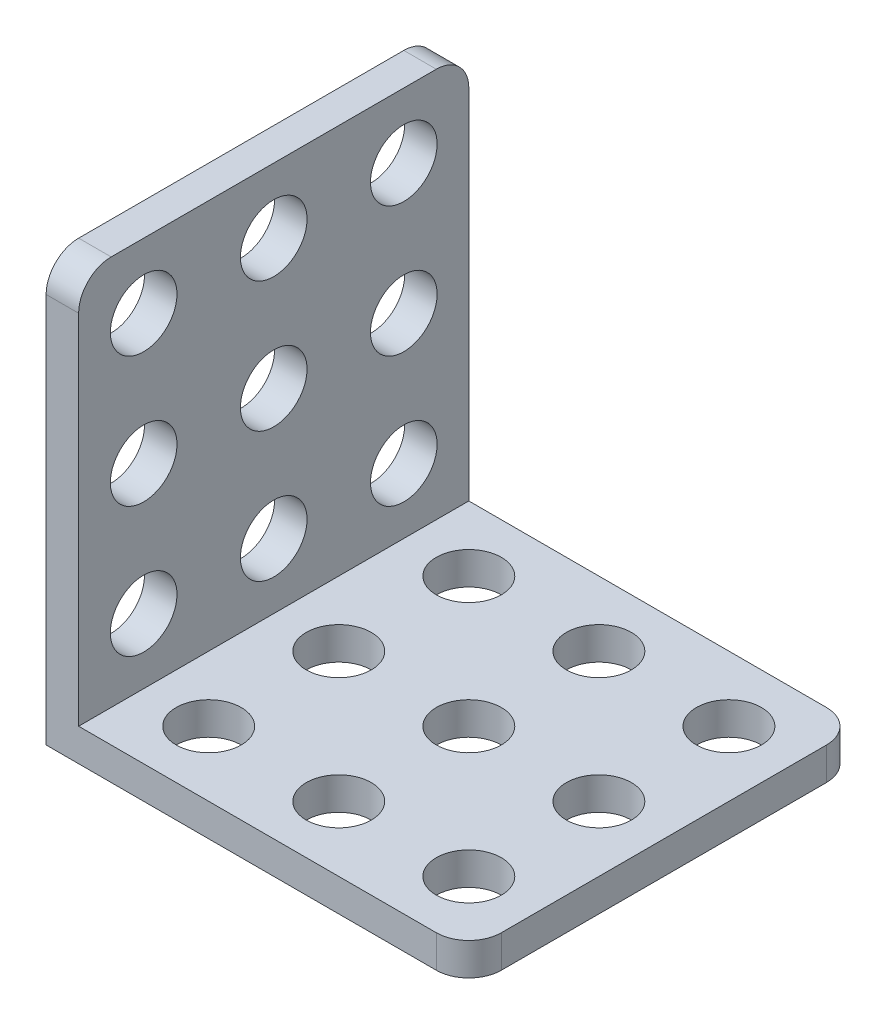
ISO-10303-21;
HEADER;
FILE_DESCRIPTION(('STEP AP214'),'2;1');
FILE_NAME('part.step','',(''),(''),'','','');
FILE_SCHEMA(('AUTOMOTIVE_DESIGN { 1 0 10303 214 1 1 1 1 }'));
ENDSEC;
DATA;
#1=APPLICATION_CONTEXT('core data for automotive mechanical design processes');
#2=APPLICATION_PROTOCOL_DEFINITION('international standard','automotive_design',2000,#1);
#3=PRODUCT_CONTEXT('',#1,'mechanical');
#4=PRODUCT('Part','Part','',(#3));
#5=PRODUCT_RELATED_PRODUCT_CATEGORY('part','',(#4));
#6=PRODUCT_DEFINITION_FORMATION('','',#4);
#7=PRODUCT_DEFINITION_CONTEXT('part definition',#1,'design');
#8=PRODUCT_DEFINITION('design','',#6,#7);
#9=PRODUCT_DEFINITION_SHAPE('','',#8);
#10=(LENGTH_UNIT() NAMED_UNIT(*) SI_UNIT(.MILLI.,.METRE.));
#11=(NAMED_UNIT(*) PLANE_ANGLE_UNIT() SI_UNIT($,.RADIAN.));
#12=(NAMED_UNIT(*) SI_UNIT($,.STERADIAN.) SOLID_ANGLE_UNIT());
#13=UNCERTAINTY_MEASURE_WITH_UNIT(LENGTH_MEASURE(1.E-05),#10,'distance_accuracy_value','');
#14=(GEOMETRIC_REPRESENTATION_CONTEXT(3) GLOBAL_UNCERTAINTY_ASSIGNED_CONTEXT((#13)) GLOBAL_UNIT_ASSIGNED_CONTEXT((#10,
#11,#12)) REPRESENTATION_CONTEXT('',''));
#15=CARTESIAN_POINT('',(0.,0.,0.));
#16=DIRECTION('',(0.,0.,1.));
#17=DIRECTION('',(1.,0.,0.));
#18=AXIS2_PLACEMENT_3D('',#15,#16,#17);
#19=CARTESIAN_POINT('',(6.,0.,20.));
#20=DIRECTION('',(0.,1.,0.));
#21=DIRECTION('',(0.,0.,1.));
#22=AXIS2_PLACEMENT_3D('',#19,#20,#21);
#23=CYLINDRICAL_SURFACE('',#22,2.);
#24=CARTESIAN_POINT('',(6.,0.,20.));
#25=DIRECTION('',(0.,1.,0.));
#26=DIRECTION('',(0.,0.,1.));
#27=AXIS2_PLACEMENT_3D('',#24,#25,#26);
#28=CIRCLE('',#27,2.);
#29=CARTESIAN_POINT('',(6.,0.,22.));
#30=VERTEX_POINT('',#29);
#31=EDGE_CURVE('E243',#30,#30,#28,.T.);
#32=ORIENTED_EDGE('',*,*,#31,.F.);
#33=EDGE_LOOP('',(#32));
#34=FACE_BOUND('',#33,.T.);
#35=CARTESIAN_POINT('',(6.,2.,20.));
#36=DIRECTION('',(0.,1.,0.));
#37=DIRECTION('',(0.,0.,1.));
#38=AXIS2_PLACEMENT_3D('',#35,#36,#37);
#39=CIRCLE('',#38,2.);
#40=CARTESIAN_POINT('',(6.,2.,22.));
#41=VERTEX_POINT('',#40);
#42=EDGE_CURVE('E246',#41,#41,#39,.T.);
#43=ORIENTED_EDGE('',*,*,#42,.T.);
#44=EDGE_LOOP('',(#43));
#45=FACE_BOUND('',#44,.T.);
#46=ADVANCED_FACE('F32',(#34,#45),#23,.F.);
#47=CARTESIAN_POINT('',(6.,0.,12.));
#48=DIRECTION('',(0.,1.,0.));
#49=DIRECTION('',(0.,0.,1.));
#50=AXIS2_PLACEMENT_3D('',#47,#48,#49);
#51=CYLINDRICAL_SURFACE('',#50,2.);
#52=CARTESIAN_POINT('',(6.,0.,12.));
#53=DIRECTION('',(0.,1.,0.));
#54=DIRECTION('',(0.,0.,1.));
#55=AXIS2_PLACEMENT_3D('',#52,#53,#54);
#56=CIRCLE('',#55,2.);
#57=CARTESIAN_POINT('',(6.,0.,14.));
#58=VERTEX_POINT('',#57);
#59=EDGE_CURVE('E237',#58,#58,#56,.T.);
#60=ORIENTED_EDGE('',*,*,#59,.F.);
#61=EDGE_LOOP('',(#60));
#62=FACE_BOUND('',#61,.T.);
#63=CARTESIAN_POINT('',(6.,2.,12.));
#64=DIRECTION('',(0.,1.,0.));
#65=DIRECTION('',(0.,0.,1.));
#66=AXIS2_PLACEMENT_3D('',#63,#64,#65);
#67=CIRCLE('',#66,2.);
#68=CARTESIAN_POINT('',(6.,2.,14.));
#69=VERTEX_POINT('',#68);
#70=EDGE_CURVE('E240',#69,#69,#67,.T.);
#71=ORIENTED_EDGE('',*,*,#70,.T.);
#72=EDGE_LOOP('',(#71));
#73=FACE_BOUND('',#72,.T.);
#74=ADVANCED_FACE('F318',(#62,#73),#51,.F.);
#75=CARTESIAN_POINT('',(6.,0.,4.));
#76=DIRECTION('',(0.,1.,0.));
#77=DIRECTION('',(0.,0.,1.));
#78=AXIS2_PLACEMENT_3D('',#75,#76,#77);
#79=CYLINDRICAL_SURFACE('',#78,2.);
#80=CARTESIAN_POINT('',(6.,0.,4.));
#81=DIRECTION('',(0.,1.,0.));
#82=DIRECTION('',(0.,0.,1.));
#83=AXIS2_PLACEMENT_3D('',#80,#81,#82);
#84=CIRCLE('',#83,2.);
#85=CARTESIAN_POINT('',(6.,0.,6.));
#86=VERTEX_POINT('',#85);
#87=EDGE_CURVE('E231',#86,#86,#84,.T.);
#88=ORIENTED_EDGE('',*,*,#87,.F.);
#89=EDGE_LOOP('',(#88));
#90=FACE_BOUND('',#89,.T.);
#91=CARTESIAN_POINT('',(6.,2.,4.));
#92=DIRECTION('',(0.,1.,0.));
#93=DIRECTION('',(0.,0.,1.));
#94=AXIS2_PLACEMENT_3D('',#91,#92,#93);
#95=CIRCLE('',#94,2.);
#96=CARTESIAN_POINT('',(6.,2.,6.));
#97=VERTEX_POINT('',#96);
#98=EDGE_CURVE('E234',#97,#97,#95,.T.);
#99=ORIENTED_EDGE('',*,*,#98,.T.);
#100=EDGE_LOOP('',(#99));
#101=FACE_BOUND('',#100,.T.);
#102=ADVANCED_FACE('F323',(#90,#101),#79,.F.);
#103=CARTESIAN_POINT('',(14.,0.,20.));
#104=DIRECTION('',(0.,1.,0.));
#105=DIRECTION('',(0.,0.,1.));
#106=AXIS2_PLACEMENT_3D('',#103,#104,#105);
#107=CYLINDRICAL_SURFACE('',#106,2.);
#108=CARTESIAN_POINT('',(14.,0.,20.));
#109=DIRECTION('',(0.,1.,0.));
#110=DIRECTION('',(0.,0.,1.));
#111=AXIS2_PLACEMENT_3D('',#108,#109,#110);
#112=CIRCLE('',#111,2.);
#113=CARTESIAN_POINT('',(14.,0.,22.));
#114=VERTEX_POINT('',#113);
#115=EDGE_CURVE('E225',#114,#114,#112,.T.);
#116=ORIENTED_EDGE('',*,*,#115,.F.);
#117=EDGE_LOOP('',(#116));
#118=FACE_BOUND('',#117,.T.);
#119=CARTESIAN_POINT('',(14.,2.,20.));
#120=DIRECTION('',(0.,1.,0.));
#121=DIRECTION('',(0.,0.,1.));
#122=AXIS2_PLACEMENT_3D('',#119,#120,#121);
#123=CIRCLE('',#122,2.);
#124=CARTESIAN_POINT('',(14.,2.,22.));
#125=VERTEX_POINT('',#124);
#126=EDGE_CURVE('E228',#125,#125,#123,.T.);
#127=ORIENTED_EDGE('',*,*,#126,.T.);
#128=EDGE_LOOP('',(#127));
#129=FACE_BOUND('',#128,.T.);
#130=ADVANCED_FACE('F331',(#118,#129),#107,.F.);
#131=CARTESIAN_POINT('',(14.,0.,12.));
#132=DIRECTION('',(0.,1.,0.));
#133=DIRECTION('',(0.,0.,1.));
#134=AXIS2_PLACEMENT_3D('',#131,#132,#133);
#135=CYLINDRICAL_SURFACE('',#134,2.);
#136=CARTESIAN_POINT('',(14.,0.,12.));
#137=DIRECTION('',(0.,1.,0.));
#138=DIRECTION('',(0.,0.,1.));
#139=AXIS2_PLACEMENT_3D('',#136,#137,#138);
#140=CIRCLE('',#139,2.);
#141=CARTESIAN_POINT('',(14.,0.,14.));
#142=VERTEX_POINT('',#141);
#143=EDGE_CURVE('E219',#142,#142,#140,.T.);
#144=ORIENTED_EDGE('',*,*,#143,.F.);
#145=EDGE_LOOP('',(#144));
#146=FACE_BOUND('',#145,.T.);
#147=CARTESIAN_POINT('',(14.,2.,12.));
#148=DIRECTION('',(0.,1.,0.));
#149=DIRECTION('',(0.,0.,1.));
#150=AXIS2_PLACEMENT_3D('',#147,#148,#149);
#151=CIRCLE('',#150,2.);
#152=CARTESIAN_POINT('',(14.,2.,14.));
#153=VERTEX_POINT('',#152);
#154=EDGE_CURVE('E222',#153,#153,#151,.T.);
#155=ORIENTED_EDGE('',*,*,#154,.T.);
#156=EDGE_LOOP('',(#155));
#157=FACE_BOUND('',#156,.T.);
#158=ADVANCED_FACE('F335',(#146,#157),#135,.F.);
#159=CARTESIAN_POINT('',(14.,0.,4.));
#160=DIRECTION('',(0.,1.,0.));
#161=DIRECTION('',(0.,0.,1.));
#162=AXIS2_PLACEMENT_3D('',#159,#160,#161);
#163=CYLINDRICAL_SURFACE('',#162,2.);
#164=CARTESIAN_POINT('',(14.,0.,4.));
#165=DIRECTION('',(0.,1.,0.));
#166=DIRECTION('',(0.,0.,1.));
#167=AXIS2_PLACEMENT_3D('',#164,#165,#166);
#168=CIRCLE('',#167,2.);
#169=CARTESIAN_POINT('',(14.,0.,6.));
#170=VERTEX_POINT('',#169);
#171=EDGE_CURVE('E213',#170,#170,#168,.T.);
#172=ORIENTED_EDGE('',*,*,#171,.F.);
#173=EDGE_LOOP('',(#172));
#174=FACE_BOUND('',#173,.T.);
#175=CARTESIAN_POINT('',(14.,2.,4.));
#176=DIRECTION('',(0.,1.,0.));
#177=DIRECTION('',(0.,0.,1.));
#178=AXIS2_PLACEMENT_3D('',#175,#176,#177);
#179=CIRCLE('',#178,2.);
#180=CARTESIAN_POINT('',(14.,2.,6.));
#181=VERTEX_POINT('',#180);
#182=EDGE_CURVE('E216',#181,#181,#179,.T.);
#183=ORIENTED_EDGE('',*,*,#182,.T.);
#184=EDGE_LOOP('',(#183));
#185=FACE_BOUND('',#184,.T.);
#186=ADVANCED_FACE('F339',(#174,#185),#163,.F.);
#187=CARTESIAN_POINT('',(22.,0.,20.));
#188=DIRECTION('',(0.,1.,0.));
#189=DIRECTION('',(0.,0.,1.));
#190=AXIS2_PLACEMENT_3D('',#187,#188,#189);
#191=CYLINDRICAL_SURFACE('',#190,2.);
#192=CARTESIAN_POINT('',(22.,0.,20.));
#193=DIRECTION('',(0.,1.,0.));
#194=DIRECTION('',(0.,0.,1.));
#195=AXIS2_PLACEMENT_3D('',#192,#193,#194);
#196=CIRCLE('',#195,2.);
#197=CARTESIAN_POINT('',(22.,0.,22.));
#198=VERTEX_POINT('',#197);
#199=EDGE_CURVE('E207',#198,#198,#196,.T.);
#200=ORIENTED_EDGE('',*,*,#199,.F.);
#201=EDGE_LOOP('',(#200));
#202=FACE_BOUND('',#201,.T.);
#203=CARTESIAN_POINT('',(22.,2.,20.));
#204=DIRECTION('',(0.,1.,0.));
#205=DIRECTION('',(0.,0.,1.));
#206=AXIS2_PLACEMENT_3D('',#203,#204,#205);
#207=CIRCLE('',#206,2.);
#208=CARTESIAN_POINT('',(22.,2.,22.));
#209=VERTEX_POINT('',#208);
#210=EDGE_CURVE('E210',#209,#209,#207,.T.);
#211=ORIENTED_EDGE('',*,*,#210,.T.);
#212=EDGE_LOOP('',(#211));
#213=FACE_BOUND('',#212,.T.);
#214=ADVANCED_FACE('F343',(#202,#213),#191,.F.);
#215=CARTESIAN_POINT('',(0.,6.,4.));
#216=DIRECTION('',(1.,0.,0.));
#217=DIRECTION('',(0.,1.,0.));
#218=AXIS2_PLACEMENT_3D('',#215,#216,#217);
#219=CYLINDRICAL_SURFACE('',#218,2.05);
#220=CARTESIAN_POINT('',(0.,6.,4.));
#221=DIRECTION('',(1.,0.,0.));
#222=DIRECTION('',(0.,1.,0.));
#223=AXIS2_PLACEMENT_3D('',#220,#221,#222);
#224=CIRCLE('',#223,2.05);
#225=CARTESIAN_POINT('',(0.,8.05,4.));
#226=VERTEX_POINT('',#225);
#227=EDGE_CURVE('E201',#226,#226,#224,.T.);
#228=ORIENTED_EDGE('',*,*,#227,.F.);
#229=EDGE_LOOP('',(#228));
#230=FACE_BOUND('',#229,.T.);
#231=CARTESIAN_POINT('',(2.,6.,4.));
#232=DIRECTION('',(1.,0.,0.));
#233=DIRECTION('',(0.,1.,0.));
#234=AXIS2_PLACEMENT_3D('',#231,#232,#233);
#235=CIRCLE('',#234,2.05);
#236=CARTESIAN_POINT('',(2.,8.05,4.));
#237=VERTEX_POINT('',#236);
#238=EDGE_CURVE('E204',#237,#237,#235,.T.);
#239=ORIENTED_EDGE('',*,*,#238,.T.);
#240=EDGE_LOOP('',(#239));
#241=FACE_BOUND('',#240,.T.);
#242=ADVANCED_FACE('F347',(#230,#241),#219,.F.);
#243=CARTESIAN_POINT('',(0.,6.,12.));
#244=DIRECTION('',(1.,0.,0.));
#245=DIRECTION('',(0.,1.,0.));
#246=AXIS2_PLACEMENT_3D('',#243,#244,#245);
#247=CYLINDRICAL_SURFACE('',#246,2.05);
#248=CARTESIAN_POINT('',(0.,6.,12.));
#249=DIRECTION('',(1.,0.,0.));
#250=DIRECTION('',(0.,1.,0.));
#251=AXIS2_PLACEMENT_3D('',#248,#249,#250);
#252=CIRCLE('',#251,2.05);
#253=CARTESIAN_POINT('',(0.,8.05,12.));
#254=VERTEX_POINT('',#253);
#255=EDGE_CURVE('E195',#254,#254,#252,.T.);
#256=ORIENTED_EDGE('',*,*,#255,.F.);
#257=EDGE_LOOP('',(#256));
#258=FACE_BOUND('',#257,.T.);
#259=CARTESIAN_POINT('',(2.,6.,12.));
#260=DIRECTION('',(1.,0.,0.));
#261=DIRECTION('',(0.,1.,0.));
#262=AXIS2_PLACEMENT_3D('',#259,#260,#261);
#263=CIRCLE('',#262,2.05);
#264=CARTESIAN_POINT('',(2.,8.05,12.));
#265=VERTEX_POINT('',#264);
#266=EDGE_CURVE('E198',#265,#265,#263,.T.);
#267=ORIENTED_EDGE('',*,*,#266,.T.);
#268=EDGE_LOOP('',(#267));
#269=FACE_BOUND('',#268,.T.);
#270=ADVANCED_FACE('F351',(#258,#269),#247,.F.);
#271=CARTESIAN_POINT('',(0.,6.,20.));
#272=DIRECTION('',(1.,0.,0.));
#273=DIRECTION('',(0.,1.,0.));
#274=AXIS2_PLACEMENT_3D('',#271,#272,#273);
#275=CYLINDRICAL_SURFACE('',#274,2.05);
#276=CARTESIAN_POINT('',(0.,6.,20.));
#277=DIRECTION('',(1.,0.,0.));
#278=DIRECTION('',(0.,1.,0.));
#279=AXIS2_PLACEMENT_3D('',#276,#277,#278);
#280=CIRCLE('',#279,2.05);
#281=CARTESIAN_POINT('',(0.,8.05,20.));
#282=VERTEX_POINT('',#281);
#283=EDGE_CURVE('E189',#282,#282,#280,.T.);
#284=ORIENTED_EDGE('',*,*,#283,.F.);
#285=EDGE_LOOP('',(#284));
#286=FACE_BOUND('',#285,.T.);
#287=CARTESIAN_POINT('',(2.,6.,20.));
#288=DIRECTION('',(1.,0.,0.));
#289=DIRECTION('',(0.,1.,0.));
#290=AXIS2_PLACEMENT_3D('',#287,#288,#289);
#291=CIRCLE('',#290,2.05);
#292=CARTESIAN_POINT('',(2.,8.05,20.));
#293=VERTEX_POINT('',#292);
#294=EDGE_CURVE('E192',#293,#293,#291,.T.);
#295=ORIENTED_EDGE('',*,*,#294,.T.);
#296=EDGE_LOOP('',(#295));
#297=FACE_BOUND('',#296,.T.);
#298=ADVANCED_FACE('F355',(#286,#297),#275,.F.);
#299=CARTESIAN_POINT('',(0.,14.,4.));
#300=DIRECTION('',(1.,0.,0.));
#301=DIRECTION('',(0.,1.,0.));
#302=AXIS2_PLACEMENT_3D('',#299,#300,#301);
#303=CYLINDRICAL_SURFACE('',#302,2.05);
#304=CARTESIAN_POINT('',(0.,14.,4.));
#305=DIRECTION('',(1.,0.,0.));
#306=DIRECTION('',(0.,1.,0.));
#307=AXIS2_PLACEMENT_3D('',#304,#305,#306);
#308=CIRCLE('',#307,2.05);
#309=CARTESIAN_POINT('',(0.,16.05,4.));
#310=VERTEX_POINT('',#309);
#311=EDGE_CURVE('E183',#310,#310,#308,.T.);
#312=ORIENTED_EDGE('',*,*,#311,.F.);
#313=EDGE_LOOP('',(#312));
#314=FACE_BOUND('',#313,.T.);
#315=CARTESIAN_POINT('',(2.,14.,4.));
#316=DIRECTION('',(1.,0.,0.));
#317=DIRECTION('',(0.,1.,0.));
#318=AXIS2_PLACEMENT_3D('',#315,#316,#317);
#319=CIRCLE('',#318,2.05);
#320=CARTESIAN_POINT('',(2.,16.05,4.));
#321=VERTEX_POINT('',#320);
#322=EDGE_CURVE('E186',#321,#321,#319,.T.);
#323=ORIENTED_EDGE('',*,*,#322,.T.);
#324=EDGE_LOOP('',(#323));
#325=FACE_BOUND('',#324,.T.);
#326=ADVANCED_FACE('F359',(#314,#325),#303,.F.);
#327=CARTESIAN_POINT('',(0.,14.,12.));
#328=DIRECTION('',(1.,0.,0.));
#329=DIRECTION('',(0.,1.,0.));
#330=AXIS2_PLACEMENT_3D('',#327,#328,#329);
#331=CYLINDRICAL_SURFACE('',#330,2.05);
#332=CARTESIAN_POINT('',(0.,14.,12.));
#333=DIRECTION('',(1.,0.,0.));
#334=DIRECTION('',(0.,1.,0.));
#335=AXIS2_PLACEMENT_3D('',#332,#333,#334);
#336=CIRCLE('',#335,2.05);
#337=CARTESIAN_POINT('',(0.,16.05,12.));
#338=VERTEX_POINT('',#337);
#339=EDGE_CURVE('E177',#338,#338,#336,.T.);
#340=ORIENTED_EDGE('',*,*,#339,.F.);
#341=EDGE_LOOP('',(#340));
#342=FACE_BOUND('',#341,.T.);
#343=CARTESIAN_POINT('',(2.,14.,12.));
#344=DIRECTION('',(1.,0.,0.));
#345=DIRECTION('',(0.,1.,0.));
#346=AXIS2_PLACEMENT_3D('',#343,#344,#345);
#347=CIRCLE('',#346,2.05);
#348=CARTESIAN_POINT('',(2.,16.05,12.));
#349=VERTEX_POINT('',#348);
#350=EDGE_CURVE('E180',#349,#349,#347,.T.);
#351=ORIENTED_EDGE('',*,*,#350,.T.);
#352=EDGE_LOOP('',(#351));
#353=FACE_BOUND('',#352,.T.);
#354=ADVANCED_FACE('F363',(#342,#353),#331,.F.);
#355=CARTESIAN_POINT('',(0.,14.,20.));
#356=DIRECTION('',(1.,0.,0.));
#357=DIRECTION('',(0.,1.,0.));
#358=AXIS2_PLACEMENT_3D('',#355,#356,#357);
#359=CYLINDRICAL_SURFACE('',#358,2.05);
#360=CARTESIAN_POINT('',(0.,14.,20.));
#361=DIRECTION('',(1.,0.,0.));
#362=DIRECTION('',(0.,1.,0.));
#363=AXIS2_PLACEMENT_3D('',#360,#361,#362);
#364=CIRCLE('',#363,2.05);
#365=CARTESIAN_POINT('',(0.,16.05,20.));
#366=VERTEX_POINT('',#365);
#367=EDGE_CURVE('E171',#366,#366,#364,.T.);
#368=ORIENTED_EDGE('',*,*,#367,.F.);
#369=EDGE_LOOP('',(#368));
#370=FACE_BOUND('',#369,.T.);
#371=CARTESIAN_POINT('',(2.,14.,20.));
#372=DIRECTION('',(1.,0.,0.));
#373=DIRECTION('',(0.,1.,0.));
#374=AXIS2_PLACEMENT_3D('',#371,#372,#373);
#375=CIRCLE('',#374,2.05);
#376=CARTESIAN_POINT('',(2.,16.05,20.));
#377=VERTEX_POINT('',#376);
#378=EDGE_CURVE('E174',#377,#377,#375,.T.);
#379=ORIENTED_EDGE('',*,*,#378,.T.);
#380=EDGE_LOOP('',(#379));
#381=FACE_BOUND('',#380,.T.);
#382=ADVANCED_FACE('F367',(#370,#381),#359,.F.);
#383=CARTESIAN_POINT('',(0.,22.,4.));
#384=DIRECTION('',(1.,0.,0.));
#385=DIRECTION('',(0.,1.,0.));
#386=AXIS2_PLACEMENT_3D('',#383,#384,#385);
#387=CYLINDRICAL_SURFACE('',#386,2.05);
#388=CARTESIAN_POINT('',(0.,22.,4.));
#389=DIRECTION('',(1.,0.,0.));
#390=DIRECTION('',(0.,1.,0.));
#391=AXIS2_PLACEMENT_3D('',#388,#389,#390);
#392=CIRCLE('',#391,2.05);
#393=CARTESIAN_POINT('',(0.,24.05,4.));
#394=VERTEX_POINT('',#393);
#395=EDGE_CURVE('E165',#394,#394,#392,.T.);
#396=ORIENTED_EDGE('',*,*,#395,.F.);
#397=EDGE_LOOP('',(#396));
#398=FACE_BOUND('',#397,.T.);
#399=CARTESIAN_POINT('',(2.,22.,4.));
#400=DIRECTION('',(1.,0.,0.));
#401=DIRECTION('',(0.,1.,0.));
#402=AXIS2_PLACEMENT_3D('',#399,#400,#401);
#403=CIRCLE('',#402,2.05);
#404=CARTESIAN_POINT('',(2.,24.05,4.));
#405=VERTEX_POINT('',#404);
#406=EDGE_CURVE('E168',#405,#405,#403,.T.);
#407=ORIENTED_EDGE('',*,*,#406,.T.);
#408=EDGE_LOOP('',(#407));
#409=FACE_BOUND('',#408,.T.);
#410=ADVANCED_FACE('F371',(#398,#409),#387,.F.);
#411=CARTESIAN_POINT('',(26.,0.,24.));
#412=DIRECTION('',(0.,1.,0.));
#413=DIRECTION('',(-1.,0.,0.));
#414=AXIS2_PLACEMENT_3D('',#411,#412,#413);
#415=PLANE('',#414);
#416=CARTESIAN_POINT('',(22.,0.,12.));
#417=DIRECTION('',(0.,1.,0.));
#418=DIRECTION('',(0.,0.,1.));
#419=AXIS2_PLACEMENT_3D('',#416,#417,#418);
#420=CIRCLE('',#419,2.);
#421=CARTESIAN_POINT('',(22.,0.,14.));
#422=VERTEX_POINT('',#421);
#423=EDGE_CURVE('E421',#422,#422,#420,.T.);
#424=ORIENTED_EDGE('',*,*,#423,.T.);
#425=EDGE_LOOP('',(#424));
#426=FACE_BOUND('',#425,.T.);
#427=CARTESIAN_POINT('',(22.,0.,4.));
#428=DIRECTION('',(0.,1.,0.));
#429=DIRECTION('',(0.,0.,1.));
#430=AXIS2_PLACEMENT_3D('',#427,#428,#429);
#431=CIRCLE('',#430,2.);
#432=CARTESIAN_POINT('',(22.,0.,6.));
#433=VERTEX_POINT('',#432);
#434=EDGE_CURVE('E411',#433,#433,#431,.T.);
#435=ORIENTED_EDGE('',*,*,#434,.T.);
#436=EDGE_LOOP('',(#435));
#437=FACE_BOUND('',#436,.T.);
#438=DIRECTION('',(1.,0.,0.));
#439=VECTOR('',#438,1.);
#440=CARTESIAN_POINT('',(26.,0.,0.));
#441=LINE('',#440,#439);
#442=CARTESIAN_POINT('',(0.,0.,0.));
#443=VERTEX_POINT('',#442);
#444=CARTESIAN_POINT('',(24.,0.,0.));
#445=VERTEX_POINT('',#444);
#446=EDGE_CURVE('E147',#443,#445,#441,.T.);
#447=ORIENTED_EDGE('',*,*,#446,.T.);
#448=CARTESIAN_POINT('',(24.,0.,2.));
#449=DIRECTION('',(0.,1.,0.));
#450=DIRECTION('',(-1.,0.,0.));
#451=AXIS2_PLACEMENT_3D('',#448,#449,#450);
#452=CIRCLE('',#451,2.);
#453=CARTESIAN_POINT('',(26.,0.,2.));
#454=VERTEX_POINT('',#453);
#455=EDGE_CURVE('E11',#445,#454,#452,.F.);
#456=ORIENTED_EDGE('',*,*,#455,.T.);
#457=DIRECTION('',(0.,0.,-1.));
#458=VECTOR('',#457,1.);
#459=CARTESIAN_POINT('',(26.,0.,24.));
#460=LINE('',#459,#458);
#461=CARTESIAN_POINT('',(26.,0.,22.));
#462=VERTEX_POINT('',#461);
#463=EDGE_CURVE('E163',#462,#454,#460,.T.);
#464=ORIENTED_EDGE('',*,*,#463,.F.);
#465=CARTESIAN_POINT('',(24.,0.,22.));
#466=DIRECTION('',(0.,1.,0.));
#467=DIRECTION('',(-1.,0.,0.));
#468=AXIS2_PLACEMENT_3D('',#465,#466,#467);
#469=CIRCLE('',#468,2.);
#470=CARTESIAN_POINT('',(24.,0.,24.));
#471=VERTEX_POINT('',#470);
#472=EDGE_CURVE('E40',#462,#471,#469,.F.);
#473=ORIENTED_EDGE('',*,*,#472,.T.);
#474=DIRECTION('',(1.,0.,0.));
#475=VECTOR('',#474,1.);
#476=CARTESIAN_POINT('',(26.,0.,24.));
#477=LINE('',#476,#475);
#478=CARTESIAN_POINT('',(0.,0.,24.));
#479=VERTEX_POINT('',#478);
#480=EDGE_CURVE('E121',#479,#471,#477,.T.);
#481=ORIENTED_EDGE('',*,*,#480,.F.);
#482=DIRECTION('',(0.,0.,-1.));
#483=VECTOR('',#482,1.);
#484=CARTESIAN_POINT('',(0.,0.,24.));
#485=LINE('',#484,#483);
#486=EDGE_CURVE('E143',#479,#443,#485,.T.);
#487=ORIENTED_EDGE('',*,*,#486,.T.);
#488=EDGE_LOOP('',(#447,#456,#464,#473,#481,#487));
#489=FACE_BOUND('',#488,.T.);
#490=ORIENTED_EDGE('',*,*,#199,.T.);
#491=EDGE_LOOP('',(#490));
#492=FACE_BOUND('',#491,.T.);
#493=ORIENTED_EDGE('',*,*,#171,.T.);
#494=EDGE_LOOP('',(#493));
#495=FACE_BOUND('',#494,.T.);
#496=ORIENTED_EDGE('',*,*,#143,.T.);
#497=EDGE_LOOP('',(#496));
#498=FACE_BOUND('',#497,.T.);
#499=ORIENTED_EDGE('',*,*,#115,.T.);
#500=EDGE_LOOP('',(#499));
#501=FACE_BOUND('',#500,.T.);
#502=ORIENTED_EDGE('',*,*,#87,.T.);
#503=EDGE_LOOP('',(#502));
#504=FACE_BOUND('',#503,.T.);
#505=ORIENTED_EDGE('',*,*,#59,.T.);
#506=EDGE_LOOP('',(#505));
#507=FACE_BOUND('',#506,.T.);
#508=ORIENTED_EDGE('',*,*,#31,.T.);
#509=EDGE_LOOP('',(#508));
#510=FACE_BOUND('',#509,.T.);
#511=ADVANCED_FACE('F277',(#426,#437,#489,#492,#495,#498,#501,#504,#507,#510),#415,.F.);
#512=CARTESIAN_POINT('',(26.,2.,24.));
#513=DIRECTION('',(-1.,0.,0.));
#514=DIRECTION('',(0.,0.,1.));
#515=AXIS2_PLACEMENT_3D('',#512,#513,#514);
#516=PLANE('',#515);
#517=ORIENTED_EDGE('',*,*,#463,.T.);
#518=DIRECTION('',(0.,1.,0.));
#519=VECTOR('',#518,1.);
#520=CARTESIAN_POINT('',(26.,2.,2.));
#521=LINE('',#520,#519);
#522=CARTESIAN_POINT('',(26.,2.,2.));
#523=VERTEX_POINT('',#522);
#524=EDGE_CURVE('E269',#454,#523,#521,.T.);
#525=ORIENTED_EDGE('',*,*,#524,.T.);
#526=DIRECTION('',(0.,0.,-1.));
#527=VECTOR('',#526,1.);
#528=CARTESIAN_POINT('',(26.,2.,24.));
#529=LINE('',#528,#527);
#530=CARTESIAN_POINT('',(26.,2.,22.));
#531=VERTEX_POINT('',#530);
#532=EDGE_CURVE('E133',#531,#523,#529,.T.);
#533=ORIENTED_EDGE('',*,*,#532,.F.);
#534=DIRECTION('',(0.,1.,0.));
#535=VECTOR('',#534,1.);
#536=CARTESIAN_POINT('',(26.,2.,22.));
#537=LINE('',#536,#535);
#538=EDGE_CURVE('E52',#531,#462,#537,.F.);
#539=ORIENTED_EDGE('',*,*,#538,.T.);
#540=EDGE_LOOP('',(#517,#525,#533,#539));
#541=FACE_BOUND('',#540,.T.);
#542=ADVANCED_FACE('F282',(#541),#516,.F.);
#543=CARTESIAN_POINT('',(2.,2.,24.));
#544=DIRECTION('',(0.,-1.,0.));
#545=DIRECTION('',(0.,0.,-1.));
#546=AXIS2_PLACEMENT_3D('',#543,#544,#545);
#547=PLANE('',#546);
#548=CARTESIAN_POINT('',(22.,2.,12.));
#549=DIRECTION('',(0.,1.,0.));
#550=DIRECTION('',(0.,0.,1.));
#551=AXIS2_PLACEMENT_3D('',#548,#549,#550);
#552=CIRCLE('',#551,2.);
#553=CARTESIAN_POINT('',(22.,2.,14.));
#554=VERTEX_POINT('',#553);
#555=EDGE_CURVE('E416',#554,#554,#552,.T.);
#556=ORIENTED_EDGE('',*,*,#555,.F.);
#557=EDGE_LOOP('',(#556));
#558=FACE_BOUND('',#557,.T.);
#559=CARTESIAN_POINT('',(22.,2.,4.));
#560=DIRECTION('',(0.,1.,0.));
#561=DIRECTION('',(0.,0.,1.));
#562=AXIS2_PLACEMENT_3D('',#559,#560,#561);
#563=CIRCLE('',#562,2.);
#564=CARTESIAN_POINT('',(22.,2.,6.));
#565=VERTEX_POINT('',#564);
#566=EDGE_CURVE('E414',#565,#565,#563,.T.);
#567=ORIENTED_EDGE('',*,*,#566,.F.);
#568=EDGE_LOOP('',(#567));
#569=FACE_BOUND('',#568,.T.);
#570=ORIENTED_EDGE('',*,*,#532,.T.);
#571=CARTESIAN_POINT('',(24.,2.,2.));
#572=DIRECTION('',(0.,-1.,0.));
#573=DIRECTION('',(0.,0.,-1.));
#574=AXIS2_PLACEMENT_3D('',#571,#572,#573);
#575=CIRCLE('',#574,2.);
#576=CARTESIAN_POINT('',(24.,2.,0.));
#577=VERTEX_POINT('',#576);
#578=EDGE_CURVE('E274',#523,#577,#575,.F.);
#579=ORIENTED_EDGE('',*,*,#578,.T.);
#580=DIRECTION('',(-1.,0.,0.));
#581=VECTOR('',#580,1.);
#582=CARTESIAN_POINT('',(2.,2.,0.));
#583=LINE('',#582,#581);
#584=CARTESIAN_POINT('',(2.,2.,0.));
#585=VERTEX_POINT('',#584);
#586=EDGE_CURVE('E129',#577,#585,#583,.T.);
#587=ORIENTED_EDGE('',*,*,#586,.T.);
#588=DIRECTION('',(0.,0.,-1.));
#589=VECTOR('',#588,1.);
#590=CARTESIAN_POINT('',(2.,2.,24.));
#591=LINE('',#590,#589);
#592=CARTESIAN_POINT('',(2.,2.,24.));
#593=VERTEX_POINT('',#592);
#594=EDGE_CURVE('E124',#593,#585,#591,.T.);
#595=ORIENTED_EDGE('',*,*,#594,.F.);
#596=DIRECTION('',(-1.,0.,0.));
#597=VECTOR('',#596,1.);
#598=CARTESIAN_POINT('',(2.,2.,24.));
#599=LINE('',#598,#597);
#600=CARTESIAN_POINT('',(24.,2.,24.));
#601=VERTEX_POINT('',#600);
#602=EDGE_CURVE('E110',#601,#593,#599,.T.);
#603=ORIENTED_EDGE('',*,*,#602,.F.);
#604=CARTESIAN_POINT('',(24.,2.,22.));
#605=DIRECTION('',(0.,-1.,0.));
#606=DIRECTION('',(0.,0.,-1.));
#607=AXIS2_PLACEMENT_3D('',#604,#605,#606);
#608=CIRCLE('',#607,2.);
#609=EDGE_CURVE('E272',#601,#531,#608,.F.);
#610=ORIENTED_EDGE('',*,*,#609,.T.);
#611=EDGE_LOOP('',(#570,#579,#587,#595,#603,#610));
#612=FACE_BOUND('',#611,.T.);
#613=ORIENTED_EDGE('',*,*,#210,.F.);
#614=EDGE_LOOP('',(#613));
#615=FACE_BOUND('',#614,.T.);
#616=ORIENTED_EDGE('',*,*,#182,.F.);
#617=EDGE_LOOP('',(#616));
#618=FACE_BOUND('',#617,.T.);
#619=ORIENTED_EDGE('',*,*,#154,.F.);
#620=EDGE_LOOP('',(#619));
#621=FACE_BOUND('',#620,.T.);
#622=ORIENTED_EDGE('',*,*,#126,.F.);
#623=EDGE_LOOP('',(#622));
#624=FACE_BOUND('',#623,.T.);
#625=ORIENTED_EDGE('',*,*,#98,.F.);
#626=EDGE_LOOP('',(#625));
#627=FACE_BOUND('',#626,.T.);
#628=ORIENTED_EDGE('',*,*,#70,.F.);
#629=EDGE_LOOP('',(#628));
#630=FACE_BOUND('',#629,.T.);
#631=ORIENTED_EDGE('',*,*,#42,.F.);
#632=EDGE_LOOP('',(#631));
#633=FACE_BOUND('',#632,.T.);
#634=ADVANCED_FACE('F126',(#558,#569,#612,#615,#618,#621,#624,#627,#630,#633),#547,.F.);
#635=CARTESIAN_POINT('',(2.,26.,24.));
#636=DIRECTION('',(-1.,0.,0.));
#637=DIRECTION('',(0.,-1.,0.));
#638=AXIS2_PLACEMENT_3D('',#635,#636,#637);
#639=PLANE('',#638);
#640=CARTESIAN_POINT('',(2.,22.,12.));
#641=DIRECTION('',(1.,0.,0.));
#642=DIRECTION('',(0.,1.,0.));
#643=AXIS2_PLACEMENT_3D('',#640,#641,#642);
#644=CIRCLE('',#643,2.05);
#645=CARTESIAN_POINT('',(2.,24.05,12.));
#646=VERTEX_POINT('',#645);
#647=EDGE_CURVE('E426',#646,#646,#644,.T.);
#648=ORIENTED_EDGE('',*,*,#647,.F.);
#649=EDGE_LOOP('',(#648));
#650=FACE_BOUND('',#649,.T.);
#651=CARTESIAN_POINT('',(2.,22.,20.));
#652=DIRECTION('',(1.,0.,0.));
#653=DIRECTION('',(0.,1.,0.));
#654=AXIS2_PLACEMENT_3D('',#651,#652,#653);
#655=CIRCLE('',#654,2.05);
#656=CARTESIAN_POINT('',(2.,24.05,20.));
#657=VERTEX_POINT('',#656);
#658=EDGE_CURVE('E429',#657,#657,#655,.T.);
#659=ORIENTED_EDGE('',*,*,#658,.F.);
#660=EDGE_LOOP('',(#659));
#661=FACE_BOUND('',#660,.T.);
#662=DIRECTION('',(0.,0.,-1.));
#663=VECTOR('',#662,1.);
#664=CARTESIAN_POINT('',(2.,26.,24.));
#665=LINE('',#664,#663);
#666=CARTESIAN_POINT('',(2.,26.,22.));
#667=VERTEX_POINT('',#666);
#668=CARTESIAN_POINT('',(2.,26.,2.));
#669=VERTEX_POINT('',#668);
#670=EDGE_CURVE('E134',#667,#669,#665,.T.);
#671=ORIENTED_EDGE('',*,*,#670,.F.);
#672=CARTESIAN_POINT('',(2.,24.,22.));
#673=DIRECTION('',(-1.,0.,0.));
#674=DIRECTION('',(0.,-1.,0.));
#675=AXIS2_PLACEMENT_3D('',#672,#673,#674);
#676=CIRCLE('',#675,2.);
#677=CARTESIAN_POINT('',(2.,24.,24.));
#678=VERTEX_POINT('',#677);
#679=EDGE_CURVE('E140',#667,#678,#676,.F.);
#680=ORIENTED_EDGE('',*,*,#679,.T.);
#681=DIRECTION('',(0.,1.,0.));
#682=VECTOR('',#681,1.);
#683=CARTESIAN_POINT('',(2.,26.,24.));
#684=LINE('',#683,#682);
#685=EDGE_CURVE('E115',#593,#678,#684,.T.);
#686=ORIENTED_EDGE('',*,*,#685,.F.);
#687=ORIENTED_EDGE('',*,*,#594,.T.);
#688=DIRECTION('',(0.,1.,0.));
#689=VECTOR('',#688,1.);
#690=CARTESIAN_POINT('',(2.,26.,0.));
#691=LINE('',#690,#689);
#692=CARTESIAN_POINT('',(2.,24.,0.));
#693=VERTEX_POINT('',#692);
#694=EDGE_CURVE('E151',#585,#693,#691,.T.);
#695=ORIENTED_EDGE('',*,*,#694,.T.);
#696=CARTESIAN_POINT('',(2.,24.,2.));
#697=DIRECTION('',(-1.,0.,0.));
#698=DIRECTION('',(0.,-1.,0.));
#699=AXIS2_PLACEMENT_3D('',#696,#697,#698);
#700=CIRCLE('',#699,2.);
#701=EDGE_CURVE('E261',#693,#669,#700,.F.);
#702=ORIENTED_EDGE('',*,*,#701,.T.);
#703=EDGE_LOOP('',(#671,#680,#686,#687,#695,#702));
#704=FACE_BOUND('',#703,.T.);
#705=ORIENTED_EDGE('',*,*,#406,.F.);
#706=EDGE_LOOP('',(#705));
#707=FACE_BOUND('',#706,.T.);
#708=ORIENTED_EDGE('',*,*,#378,.F.);
#709=EDGE_LOOP('',(#708));
#710=FACE_BOUND('',#709,.T.);
#711=ORIENTED_EDGE('',*,*,#350,.F.);
#712=EDGE_LOOP('',(#711));
#713=FACE_BOUND('',#712,.T.);
#714=ORIENTED_EDGE('',*,*,#322,.F.);
#715=EDGE_LOOP('',(#714));
#716=FACE_BOUND('',#715,.T.);
#717=ORIENTED_EDGE('',*,*,#294,.F.);
#718=EDGE_LOOP('',(#717));
#719=FACE_BOUND('',#718,.T.);
#720=ORIENTED_EDGE('',*,*,#266,.F.);
#721=EDGE_LOOP('',(#720));
#722=FACE_BOUND('',#721,.T.);
#723=ORIENTED_EDGE('',*,*,#238,.F.);
#724=EDGE_LOOP('',(#723));
#725=FACE_BOUND('',#724,.T.);
#726=ADVANCED_FACE('F137',(#650,#661,#704,#707,#710,#713,#716,#719,#722,#725),#639,.F.);
#727=CARTESIAN_POINT('',(0.,26.,24.));
#728=DIRECTION('',(0.,-1.,0.));
#729=DIRECTION('',(0.,0.,-1.));
#730=AXIS2_PLACEMENT_3D('',#727,#728,#729);
#731=PLANE('',#730);
#732=DIRECTION('',(0.,0.,-1.));
#733=VECTOR('',#732,1.);
#734=CARTESIAN_POINT('',(0.,26.,24.));
#735=LINE('',#734,#733);
#736=CARTESIAN_POINT('',(0.,26.,22.));
#737=VERTEX_POINT('',#736);
#738=CARTESIAN_POINT('',(0.,26.,2.));
#739=VERTEX_POINT('',#738);
#740=EDGE_CURVE('E157',#737,#739,#735,.T.);
#741=ORIENTED_EDGE('',*,*,#740,.F.);
#742=DIRECTION('',(-1.,0.,0.));
#743=VECTOR('',#742,1.);
#744=CARTESIAN_POINT('',(0.,26.,22.));
#745=LINE('',#744,#743);
#746=EDGE_CURVE('E259',#737,#667,#745,.F.);
#747=ORIENTED_EDGE('',*,*,#746,.T.);
#748=ORIENTED_EDGE('',*,*,#670,.T.);
#749=DIRECTION('',(-1.,0.,0.));
#750=VECTOR('',#749,1.);
#751=CARTESIAN_POINT('',(0.,26.,2.));
#752=LINE('',#751,#750);
#753=EDGE_CURVE('E256',#669,#739,#752,.T.);
#754=ORIENTED_EDGE('',*,*,#753,.T.);
#755=EDGE_LOOP('',(#741,#747,#748,#754));
#756=FACE_BOUND('',#755,.T.);
#757=ADVANCED_FACE('F298',(#756),#731,.F.);
#758=CARTESIAN_POINT('',(0.,0.,24.));
#759=DIRECTION('',(1.,0.,0.));
#760=DIRECTION('',(0.,0.,-1.));
#761=AXIS2_PLACEMENT_3D('',#758,#759,#760);
#762=PLANE('',#761);
#763=CARTESIAN_POINT('',(0.,22.,12.));
#764=DIRECTION('',(1.,0.,0.));
#765=DIRECTION('',(0.,1.,0.));
#766=AXIS2_PLACEMENT_3D('',#763,#764,#765);
#767=CIRCLE('',#766,2.05);
#768=CARTESIAN_POINT('',(0.,24.05,12.));
#769=VERTEX_POINT('',#768);
#770=EDGE_CURVE('E418',#769,#769,#767,.T.);
#771=ORIENTED_EDGE('',*,*,#770,.T.);
#772=EDGE_LOOP('',(#771));
#773=FACE_BOUND('',#772,.T.);
#774=CARTESIAN_POINT('',(0.,22.,20.));
#775=DIRECTION('',(1.,0.,0.));
#776=DIRECTION('',(0.,1.,0.));
#777=AXIS2_PLACEMENT_3D('',#774,#775,#776);
#778=CIRCLE('',#777,2.05);
#779=CARTESIAN_POINT('',(0.,24.05,20.));
#780=VERTEX_POINT('',#779);
#781=EDGE_CURVE('E149',#780,#780,#778,.T.);
#782=ORIENTED_EDGE('',*,*,#781,.T.);
#783=EDGE_LOOP('',(#782));
#784=FACE_BOUND('',#783,.T.);
#785=DIRECTION('',(0.,-1.,0.));
#786=VECTOR('',#785,1.);
#787=CARTESIAN_POINT('',(0.,0.,24.));
#788=LINE('',#787,#786);
#789=CARTESIAN_POINT('',(0.,24.,24.));
#790=VERTEX_POINT('',#789);
#791=EDGE_CURVE('E141',#790,#479,#788,.T.);
#792=ORIENTED_EDGE('',*,*,#791,.F.);
#793=CARTESIAN_POINT('',(0.,24.,22.));
#794=DIRECTION('',(1.,0.,0.));
#795=DIRECTION('',(0.,0.,-1.));
#796=AXIS2_PLACEMENT_3D('',#793,#794,#795);
#797=CIRCLE('',#796,2.);
#798=EDGE_CURVE('E254',#790,#737,#797,.F.);
#799=ORIENTED_EDGE('',*,*,#798,.T.);
#800=ORIENTED_EDGE('',*,*,#740,.T.);
#801=CARTESIAN_POINT('',(0.,24.,2.));
#802=DIRECTION('',(1.,0.,0.));
#803=DIRECTION('',(0.,0.,-1.));
#804=AXIS2_PLACEMENT_3D('',#801,#802,#803);
#805=CIRCLE('',#804,2.);
#806=CARTESIAN_POINT('',(0.,24.,0.));
#807=VERTEX_POINT('',#806);
#808=EDGE_CURVE('E252',#739,#807,#805,.F.);
#809=ORIENTED_EDGE('',*,*,#808,.T.);
#810=DIRECTION('',(0.,-1.,0.));
#811=VECTOR('',#810,1.);
#812=CARTESIAN_POINT('',(0.,0.,0.));
#813=LINE('',#812,#811);
#814=EDGE_CURVE('E153',#807,#443,#813,.T.);
#815=ORIENTED_EDGE('',*,*,#814,.T.);
#816=ORIENTED_EDGE('',*,*,#486,.F.);
#817=EDGE_LOOP('',(#792,#799,#800,#809,#815,#816));
#818=FACE_BOUND('',#817,.T.);
#819=ORIENTED_EDGE('',*,*,#395,.T.);
#820=EDGE_LOOP('',(#819));
#821=FACE_BOUND('',#820,.T.);
#822=ORIENTED_EDGE('',*,*,#367,.T.);
#823=EDGE_LOOP('',(#822));
#824=FACE_BOUND('',#823,.T.);
#825=ORIENTED_EDGE('',*,*,#339,.T.);
#826=EDGE_LOOP('',(#825));
#827=FACE_BOUND('',#826,.T.);
#828=ORIENTED_EDGE('',*,*,#311,.T.);
#829=EDGE_LOOP('',(#828));
#830=FACE_BOUND('',#829,.T.);
#831=ORIENTED_EDGE('',*,*,#283,.T.);
#832=EDGE_LOOP('',(#831));
#833=FACE_BOUND('',#832,.T.);
#834=ORIENTED_EDGE('',*,*,#255,.T.);
#835=EDGE_LOOP('',(#834));
#836=FACE_BOUND('',#835,.T.);
#837=ORIENTED_EDGE('',*,*,#227,.T.);
#838=EDGE_LOOP('',(#837));
#839=FACE_BOUND('',#838,.T.);
#840=ADVANCED_FACE('F301',(#773,#784,#818,#821,#824,#827,#830,#833,#836,#839),#762,.F.);
#841=CARTESIAN_POINT('',(0.,0.,24.));
#842=DIRECTION('',(0.,0.,-1.));
#843=DIRECTION('',(-1.,0.,0.));
#844=AXIS2_PLACEMENT_3D('',#841,#842,#843);
#845=PLANE('',#844);
#846=ORIENTED_EDGE('',*,*,#685,.T.);
#847=DIRECTION('',(-1.,0.,0.));
#848=VECTOR('',#847,1.);
#849=CARTESIAN_POINT('',(0.,24.,24.));
#850=LINE('',#849,#848);
#851=EDGE_CURVE('E250',#678,#790,#850,.T.);
#852=ORIENTED_EDGE('',*,*,#851,.T.);
#853=ORIENTED_EDGE('',*,*,#791,.T.);
#854=ORIENTED_EDGE('',*,*,#480,.T.);
#855=DIRECTION('',(0.,1.,0.));
#856=VECTOR('',#855,1.);
#857=CARTESIAN_POINT('',(24.,0.,24.));
#858=LINE('',#857,#856);
#859=EDGE_CURVE('E119',#471,#601,#858,.T.);
#860=ORIENTED_EDGE('',*,*,#859,.T.);
#861=ORIENTED_EDGE('',*,*,#602,.T.);
#862=EDGE_LOOP('',(#846,#852,#853,#854,#860,#861));
#863=FACE_BOUND('',#862,.T.);
#864=ADVANCED_FACE('F112',(#863),#845,.F.);
#865=CARTESIAN_POINT('',(0.,0.,0.));
#866=DIRECTION('',(0.,0.,-1.));
#867=DIRECTION('',(-1.,0.,0.));
#868=AXIS2_PLACEMENT_3D('',#865,#866,#867);
#869=PLANE('',#868);
#870=ORIENTED_EDGE('',*,*,#814,.F.);
#871=DIRECTION('',(-1.,0.,0.));
#872=VECTOR('',#871,1.);
#873=CARTESIAN_POINT('',(2.,24.,0.));
#874=LINE('',#873,#872);
#875=EDGE_CURVE('E266',#807,#693,#874,.F.);
#876=ORIENTED_EDGE('',*,*,#875,.T.);
#877=ORIENTED_EDGE('',*,*,#694,.F.);
#878=ORIENTED_EDGE('',*,*,#586,.F.);
#879=DIRECTION('',(0.,1.,0.));
#880=VECTOR('',#879,1.);
#881=CARTESIAN_POINT('',(24.,0.,0.));
#882=LINE('',#881,#880);
#883=EDGE_CURVE('E264',#577,#445,#882,.F.);
#884=ORIENTED_EDGE('',*,*,#883,.T.);
#885=ORIENTED_EDGE('',*,*,#446,.F.);
#886=EDGE_LOOP('',(#870,#876,#877,#878,#884,#885));
#887=FACE_BOUND('',#886,.T.);
#888=ADVANCED_FACE('F289',(#887),#869,.T.);
#889=CARTESIAN_POINT('',(0.,22.,20.));
#890=DIRECTION('',(1.,0.,0.));
#891=DIRECTION('',(0.,1.,0.));
#892=AXIS2_PLACEMENT_3D('',#889,#890,#891);
#893=CYLINDRICAL_SURFACE('',#892,2.05);
#894=ORIENTED_EDGE('',*,*,#781,.F.);
#895=EDGE_LOOP('',(#894));
#896=FACE_BOUND('',#895,.T.);
#897=ORIENTED_EDGE('',*,*,#658,.T.);
#898=EDGE_LOOP('',(#897));
#899=FACE_BOUND('',#898,.T.);
#900=ADVANCED_FACE('F394',(#896,#899),#893,.F.);
#901=CARTESIAN_POINT('',(0.,22.,12.));
#902=DIRECTION('',(1.,0.,0.));
#903=DIRECTION('',(0.,1.,0.));
#904=AXIS2_PLACEMENT_3D('',#901,#902,#903);
#905=CYLINDRICAL_SURFACE('',#904,2.05);
#906=ORIENTED_EDGE('',*,*,#770,.F.);
#907=EDGE_LOOP('',(#906));
#908=FACE_BOUND('',#907,.T.);
#909=ORIENTED_EDGE('',*,*,#647,.T.);
#910=EDGE_LOOP('',(#909));
#911=FACE_BOUND('',#910,.T.);
#912=ADVANCED_FACE('F399',(#908,#911),#905,.F.);
#913=CARTESIAN_POINT('',(22.,0.,4.));
#914=DIRECTION('',(0.,1.,0.));
#915=DIRECTION('',(0.,0.,1.));
#916=AXIS2_PLACEMENT_3D('',#913,#914,#915);
#917=CYLINDRICAL_SURFACE('',#916,2.);
#918=ORIENTED_EDGE('',*,*,#434,.F.);
#919=EDGE_LOOP('',(#918));
#920=FACE_BOUND('',#919,.T.);
#921=ORIENTED_EDGE('',*,*,#566,.T.);
#922=EDGE_LOOP('',(#921));
#923=FACE_BOUND('',#922,.T.);
#924=ADVANCED_FACE('F313',(#920,#923),#917,.F.);
#925=CARTESIAN_POINT('',(22.,0.,12.));
#926=DIRECTION('',(0.,1.,0.));
#927=DIRECTION('',(0.,0.,1.));
#928=AXIS2_PLACEMENT_3D('',#925,#926,#927);
#929=CYLINDRICAL_SURFACE('',#928,2.);
#930=ORIENTED_EDGE('',*,*,#423,.F.);
#931=EDGE_LOOP('',(#930));
#932=FACE_BOUND('',#931,.T.);
#933=ORIENTED_EDGE('',*,*,#555,.T.);
#934=EDGE_LOOP('',(#933));
#935=FACE_BOUND('',#934,.T.);
#936=ADVANCED_FACE('F306',(#932,#935),#929,.F.);
#937=CARTESIAN_POINT('',(0.,24.,22.));
#938=DIRECTION('',(-1.,0.,0.));
#939=DIRECTION('',(0.,0.,1.));
#940=AXIS2_PLACEMENT_3D('',#937,#938,#939);
#941=CYLINDRICAL_SURFACE('',#940,2.);
#942=ORIENTED_EDGE('',*,*,#679,.F.);
#943=ORIENTED_EDGE('',*,*,#746,.F.);
#944=ORIENTED_EDGE('',*,*,#798,.F.);
#945=ORIENTED_EDGE('',*,*,#851,.F.);
#946=EDGE_LOOP('',(#942,#943,#944,#945));
#947=FACE_BOUND('',#946,.T.);
#948=ADVANCED_FACE('F304',(#947),#941,.T.);
#949=CARTESIAN_POINT('',(0.,24.,2.));
#950=DIRECTION('',(1.,0.,0.));
#951=DIRECTION('',(0.,0.,-1.));
#952=AXIS2_PLACEMENT_3D('',#949,#950,#951);
#953=CYLINDRICAL_SURFACE('',#952,2.);
#954=ORIENTED_EDGE('',*,*,#701,.F.);
#955=ORIENTED_EDGE('',*,*,#875,.F.);
#956=ORIENTED_EDGE('',*,*,#808,.F.);
#957=ORIENTED_EDGE('',*,*,#753,.F.);
#958=EDGE_LOOP('',(#954,#955,#956,#957));
#959=FACE_BOUND('',#958,.T.);
#960=ADVANCED_FACE('F295',(#959),#953,.T.);
#961=CARTESIAN_POINT('',(24.,2.,2.));
#962=DIRECTION('',(0.,-1.,0.));
#963=DIRECTION('',(0.,0.,-1.));
#964=AXIS2_PLACEMENT_3D('',#961,#962,#963);
#965=CYLINDRICAL_SURFACE('',#964,2.);
#966=ORIENTED_EDGE('',*,*,#455,.F.);
#967=ORIENTED_EDGE('',*,*,#883,.F.);
#968=ORIENTED_EDGE('',*,*,#578,.F.);
#969=ORIENTED_EDGE('',*,*,#524,.F.);
#970=EDGE_LOOP('',(#966,#967,#968,#969));
#971=FACE_BOUND('',#970,.T.);
#972=ADVANCED_FACE('F285',(#971),#965,.T.);
#973=CARTESIAN_POINT('',(24.,0.,22.));
#974=DIRECTION('',(0.,1.,0.));
#975=DIRECTION('',(0.,0.,1.));
#976=AXIS2_PLACEMENT_3D('',#973,#974,#975);
#977=CYLINDRICAL_SURFACE('',#976,2.);
#978=ORIENTED_EDGE('',*,*,#472,.F.);
#979=ORIENTED_EDGE('',*,*,#538,.F.);
#980=ORIENTED_EDGE('',*,*,#609,.F.);
#981=ORIENTED_EDGE('',*,*,#859,.F.);
#982=EDGE_LOOP('',(#978,#979,#980,#981));
#983=FACE_BOUND('',#982,.T.);
#984=ADVANCED_FACE('F34',(#983),#977,.T.);
#985=CLOSED_SHELL('',(#46,#74,#102,#130,#158,#186,#214,#242,#270,#298,#326,#354,#382,#410,#511,
#542,#634,#726,#757,#840,#864,#888,#900,#912,#924,#936,#948,#960,#972,#984));
#986=MANIFOLD_SOLID_BREP('B2',#985);
#987=ADVANCED_BREP_SHAPE_REPRESENTATION('',(#18,#986),#14);
#988=SHAPE_DEFINITION_REPRESENTATION(#9,#987);
ENDSEC;
END-ISO-10303-21;
